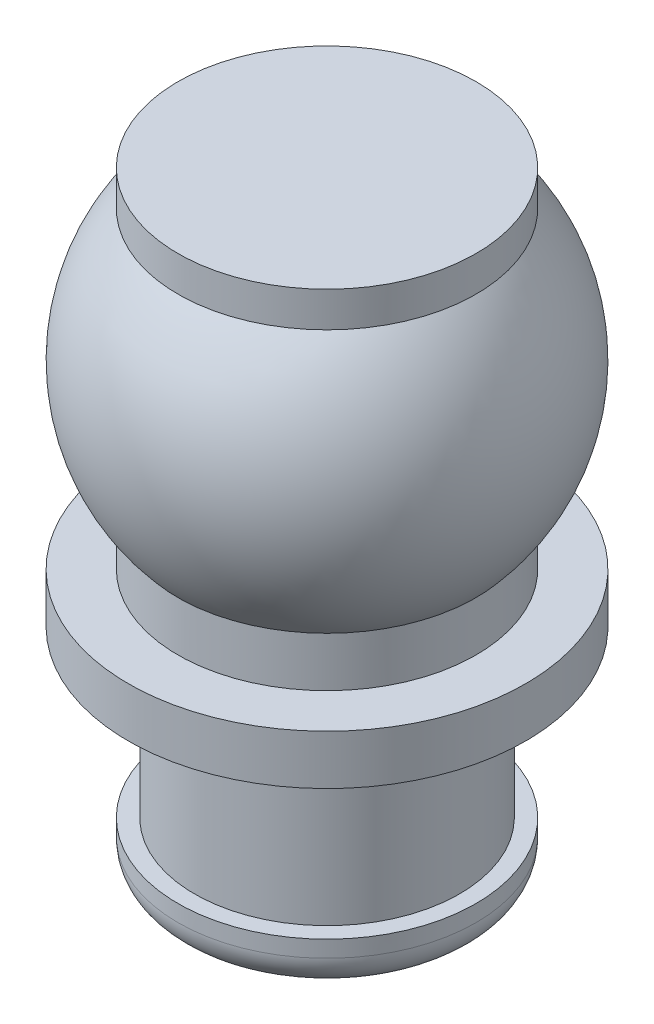
ISO-10303-21;
HEADER;
FILE_DESCRIPTION(('STEP AP214'),'2;1');
FILE_NAME('part.step','',(''),(''),'','','');
FILE_SCHEMA(('AUTOMOTIVE_DESIGN { 1 0 10303 214 1 1 1 1 }'));
ENDSEC;
DATA;
#1=APPLICATION_CONTEXT('core data for automotive mechanical design processes');
#2=APPLICATION_PROTOCOL_DEFINITION('international standard','automotive_design',2000,#1);
#3=PRODUCT_CONTEXT('',#1,'mechanical');
#4=PRODUCT('Part','Part','',(#3));
#5=PRODUCT_RELATED_PRODUCT_CATEGORY('part','',(#4));
#6=PRODUCT_DEFINITION_FORMATION('','',#4);
#7=PRODUCT_DEFINITION_CONTEXT('part definition',#1,'design');
#8=PRODUCT_DEFINITION('design','',#6,#7);
#9=PRODUCT_DEFINITION_SHAPE('','',#8);
#10=(LENGTH_UNIT() NAMED_UNIT(*) SI_UNIT(.MILLI.,.METRE.));
#11=(NAMED_UNIT(*) PLANE_ANGLE_UNIT() SI_UNIT($,.RADIAN.));
#12=(NAMED_UNIT(*) SI_UNIT($,.STERADIAN.) SOLID_ANGLE_UNIT());
#13=UNCERTAINTY_MEASURE_WITH_UNIT(LENGTH_MEASURE(1.E-05),#10,'distance_accuracy_value','');
#14=(GEOMETRIC_REPRESENTATION_CONTEXT(3) GLOBAL_UNCERTAINTY_ASSIGNED_CONTEXT((#13)) GLOBAL_UNIT_ASSIGNED_CONTEXT((#10,
#11,#12)) REPRESENTATION_CONTEXT('',''));
#15=CARTESIAN_POINT('',(0.,0.,0.));
#16=DIRECTION('',(0.,0.,1.));
#17=DIRECTION('',(1.,0.,0.));
#18=AXIS2_PLACEMENT_3D('',#15,#16,#17);
#19=CARTESIAN_POINT('',(-4.5,37.7895588976652,0.));
#20=DIRECTION('',(0.,-1.,0.));
#21=DIRECTION('',(0.,0.,-1.));
#22=AXIS2_PLACEMENT_3D('',#19,#20,#21);
#23=PLANE('',#22);
#24=CARTESIAN_POINT('',(0.,37.7895588976652,0.));
#25=DIRECTION('',(0.,-1.,0.));
#26=DIRECTION('',(0.,0.,-1.));
#27=AXIS2_PLACEMENT_3D('',#24,#25,#26);
#28=CIRCLE('',#27,6.);
#29=CARTESIAN_POINT('',(0.,37.7895588976652,-6.));
#30=VERTEX_POINT('',#29);
#31=EDGE_CURVE('E43',#30,#30,#28,.T.);
#32=ORIENTED_EDGE('',*,*,#31,.F.);
#33=EDGE_LOOP('',(#32));
#34=FACE_BOUND('',#33,.T.);
#35=CARTESIAN_POINT('',(0.,37.7895588976652,0.));
#36=DIRECTION('',(0.,-1.,0.));
#37=DIRECTION('',(0.,0.,-1.));
#38=AXIS2_PLACEMENT_3D('',#35,#36,#37);
#39=CIRCLE('',#38,4.5);
#40=CARTESIAN_POINT('',(0.,37.7895588976652,-4.5));
#41=VERTEX_POINT('',#40);
#42=EDGE_CURVE('E70',#41,#41,#39,.T.);
#43=ORIENTED_EDGE('',*,*,#42,.T.);
#44=EDGE_LOOP('',(#43));
#45=FACE_BOUND('',#44,.T.);
#46=ADVANCED_FACE('F33',(#34,#45),#23,.F.);
#47=CARTESIAN_POINT('',(0.,0.,0.));
#48=DIRECTION('',(0.,-1.,0.));
#49=DIRECTION('',(0.,0.,-1.));
#50=AXIS2_PLACEMENT_3D('',#47,#48,#49);
#51=CYLINDRICAL_SURFACE('',#50,6.);
#52=CARTESIAN_POINT('',(0.,36.2895588976652,0.));
#53=DIRECTION('',(0.,-1.,0.));
#54=DIRECTION('',(0.,0.,-1.));
#55=AXIS2_PLACEMENT_3D('',#52,#53,#54);
#56=CIRCLE('',#55,6.);
#57=CARTESIAN_POINT('',(0.,36.2895588976652,-6.));
#58=VERTEX_POINT('',#57);
#59=EDGE_CURVE('E47',#58,#58,#56,.T.);
#60=ORIENTED_EDGE('',*,*,#59,.F.);
#61=EDGE_LOOP('',(#60));
#62=FACE_BOUND('',#61,.T.);
#63=ORIENTED_EDGE('',*,*,#31,.T.);
#64=EDGE_LOOP('',(#63));
#65=FACE_BOUND('',#64,.T.);
#66=ADVANCED_FACE('F104',(#62,#65),#51,.T.);
#67=CARTESIAN_POINT('',(-6.,36.2895588976652,0.));
#68=DIRECTION('',(0.,1.,0.));
#69=DIRECTION('',(0.,0.,1.));
#70=AXIS2_PLACEMENT_3D('',#67,#68,#69);
#71=PLANE('',#70);
#72=CARTESIAN_POINT('',(0.,36.2895588976652,0.));
#73=DIRECTION('',(0.,-1.,0.));
#74=DIRECTION('',(0.,0.,-1.));
#75=AXIS2_PLACEMENT_3D('',#72,#73,#74);
#76=CIRCLE('',#75,4.);
#77=CARTESIAN_POINT('',(0.,36.2895588976652,-4.));
#78=VERTEX_POINT('',#77);
#79=EDGE_CURVE('E52',#78,#78,#76,.T.);
#80=ORIENTED_EDGE('',*,*,#79,.F.);
#81=EDGE_LOOP('',(#80));
#82=FACE_BOUND('',#81,.T.);
#83=ORIENTED_EDGE('',*,*,#59,.T.);
#84=EDGE_LOOP('',(#83));
#85=FACE_BOUND('',#84,.T.);
#86=ADVANCED_FACE('F109',(#82,#85),#71,.F.);
#87=CARTESIAN_POINT('',(0.,0.,0.));
#88=DIRECTION('',(0.,-1.,0.));
#89=DIRECTION('',(0.,0.,-1.));
#90=AXIS2_PLACEMENT_3D('',#87,#88,#89);
#91=CYLINDRICAL_SURFACE('',#90,4.);
#92=CARTESIAN_POINT('',(0.,31.2895588976652,0.));
#93=DIRECTION('',(0.,-1.,0.));
#94=DIRECTION('',(0.,0.,-1.));
#95=AXIS2_PLACEMENT_3D('',#92,#93,#94);
#96=CIRCLE('',#95,4.);
#97=CARTESIAN_POINT('',(0.,31.2895588976652,-4.));
#98=VERTEX_POINT('',#97);
#99=EDGE_CURVE('E55',#98,#98,#96,.T.);
#100=ORIENTED_EDGE('',*,*,#99,.F.);
#101=EDGE_LOOP('',(#100));
#102=FACE_BOUND('',#101,.T.);
#103=ORIENTED_EDGE('',*,*,#79,.T.);
#104=EDGE_LOOP('',(#103));
#105=FACE_BOUND('',#104,.T.);
#106=ADVANCED_FACE('F116',(#102,#105),#91,.T.);
#107=CARTESIAN_POINT('',(-4.,31.2895588976652,0.));
#108=DIRECTION('',(0.,-1.,0.));
#109=DIRECTION('',(0.,0.,-1.));
#110=AXIS2_PLACEMENT_3D('',#107,#108,#109);
#111=PLANE('',#110);
#112=CARTESIAN_POINT('',(0.,31.2895588976652,0.));
#113=DIRECTION('',(0.,-1.,0.));
#114=DIRECTION('',(0.,0.,-1.));
#115=AXIS2_PLACEMENT_3D('',#112,#113,#114);
#116=CIRCLE('',#115,4.5);
#117=CARTESIAN_POINT('',(0.,31.2895588976652,-4.5));
#118=VERTEX_POINT('',#117);
#119=EDGE_CURVE('E58',#118,#118,#116,.T.);
#120=ORIENTED_EDGE('',*,*,#119,.F.);
#121=EDGE_LOOP('',(#120));
#122=FACE_BOUND('',#121,.T.);
#123=ORIENTED_EDGE('',*,*,#99,.T.);
#124=EDGE_LOOP('',(#123));
#125=FACE_BOUND('',#124,.T.);
#126=ADVANCED_FACE('F123',(#122,#125),#111,.F.);
#127=CARTESIAN_POINT('',(0.,0.,0.));
#128=DIRECTION('',(0.,-1.,0.));
#129=DIRECTION('',(0.,0.,-1.));
#130=AXIS2_PLACEMENT_3D('',#127,#128,#129);
#131=CYLINDRICAL_SURFACE('',#130,4.5);
#132=CARTESIAN_POINT('',(0.,30.7895588976652,0.));
#133=DIRECTION('',(0.,1.,0.));
#134=DIRECTION('',(0.,0.,1.));
#135=AXIS2_PLACEMENT_3D('',#132,#133,#134);
#136=CIRCLE('',#135,4.5);
#137=CARTESIAN_POINT('',(0.,30.7895588976652,4.5));
#138=VERTEX_POINT('',#137);
#139=EDGE_CURVE('E10',#138,#138,#136,.T.);
#140=ORIENTED_EDGE('',*,*,#139,.T.);
#141=EDGE_LOOP('',(#140));
#142=FACE_BOUND('',#141,.T.);
#143=ORIENTED_EDGE('',*,*,#119,.T.);
#144=EDGE_LOOP('',(#143));
#145=FACE_BOUND('',#144,.T.);
#146=ADVANCED_FACE('F101',(#142,#145),#131,.T.);
#147=CARTESIAN_POINT('',(-4.5,29.7895588976652,0.));
#148=DIRECTION('',(0.,1.,0.));
#149=DIRECTION('',(0.,0.,1.));
#150=AXIS2_PLACEMENT_3D('',#147,#148,#149);
#151=PLANE('',#150);
#152=CARTESIAN_POINT('',(0.,29.7895588976652,0.));
#153=DIRECTION('',(0.,1.,0.));
#154=DIRECTION('',(0.,0.,1.));
#155=AXIS2_PLACEMENT_3D('',#152,#153,#154);
#156=CIRCLE('',#155,3.5);
#157=CARTESIAN_POINT('',(0.,29.7895588976652,3.5));
#158=VERTEX_POINT('',#157);
#159=EDGE_CURVE('E39',#158,#158,#156,.F.);
#160=ORIENTED_EDGE('',*,*,#159,.T.);
#161=EDGE_LOOP('',(#160));
#162=FACE_BOUND('',#161,.T.);
#163=ADVANCED_FACE('F96',(#162),#151,.F.);
#164=CARTESIAN_POINT('',(0.,48.2895588976652,0.));
#165=DIRECTION('',(0.,-1.,0.));
#166=DIRECTION('',(0.,0.,-1.));
#167=AXIS2_PLACEMENT_3D('',#164,#165,#166);
#168=PLANE('',#167);
#169=CARTESIAN_POINT('',(0.,48.2895588976652,0.));
#170=DIRECTION('',(0.,-1.,0.));
#171=DIRECTION('',(0.,0.,-1.));
#172=AXIS2_PLACEMENT_3D('',#169,#170,#171);
#173=CIRCLE('',#172,4.5);
#174=CARTESIAN_POINT('',(0.,48.2895588976652,-4.5));
#175=VERTEX_POINT('',#174);
#176=EDGE_CURVE('E61',#175,#175,#173,.T.);
#177=ORIENTED_EDGE('',*,*,#176,.F.);
#178=EDGE_LOOP('',(#177));
#179=FACE_BOUND('',#178,.T.);
#180=ADVANCED_FACE('F91',(#179),#168,.F.);
#181=CARTESIAN_POINT('',(0.,0.,0.));
#182=DIRECTION('',(0.,-1.,0.));
#183=DIRECTION('',(0.,0.,-1.));
#184=AXIS2_PLACEMENT_3D('',#181,#182,#183);
#185=CYLINDRICAL_SURFACE('',#184,4.5);
#186=CARTESIAN_POINT('',(0.,47.2268128308589,0.));
#187=DIRECTION('',(0.,-1.,0.));
#188=DIRECTION('',(0.,0.,-1.));
#189=AXIS2_PLACEMENT_3D('',#186,#187,#188);
#190=CIRCLE('',#189,4.5);
#191=CARTESIAN_POINT('',(-4.5,47.2268128308589,0.));
#192=VERTEX_POINT('',#191);
#193=EDGE_CURVE('E64',#192,#192,#190,.T.);
#194=ORIENTED_EDGE('',*,*,#193,.F.);
#195=EDGE_LOOP('',(#194));
#196=FACE_BOUND('',#195,.T.);
#197=ORIENTED_EDGE('',*,*,#176,.T.);
#198=EDGE_LOOP('',(#197));
#199=FACE_BOUND('',#198,.T.);
#200=ADVANCED_FACE('F85',(#196,#199),#185,.T.);
#201=CARTESIAN_POINT('',(0.,43.258185864262,0.));
#202=DIRECTION('',(0.,-1.,0.));
#203=DIRECTION('',(-1.,0.,0.));
#204=AXIS2_PLACEMENT_3D('',#201,#202,#203);
#205=SPHERICAL_SURFACE('',#204,6.);
#206=CARTESIAN_POINT('',(0.,39.2895588976652,0.));
#207=DIRECTION('',(0.,-1.,0.));
#208=DIRECTION('',(0.,0.,-1.));
#209=AXIS2_PLACEMENT_3D('',#206,#207,#208);
#210=CIRCLE('',#209,4.5);
#211=CARTESIAN_POINT('',(-4.5,39.2895588976652,0.));
#212=VERTEX_POINT('',#211);
#213=EDGE_CURVE('E67',#212,#212,#210,.T.);
#214=CARTESIAN_POINT('',(-4.5,39.2895588976652,0.));
#215=CARTESIAN_POINT('',(-4.55975663481962,39.3573142945571,0.));
#216=CARTESIAN_POINT('',(-4.61798068485084,39.4264211482744,0.));
#217=CARTESIAN_POINT('',(-4.73124994921595,39.5671926716747,0.));
#218=CARTESIAN_POINT('',(-4.78629516354986,39.6388573413576,0.));
#219=CARTESIAN_POINT('',(-4.89309309039987,39.784599399004,0.));
#220=CARTESIAN_POINT('',(-4.94484580291597,39.8586767869674,0.));
#221=CARTESIAN_POINT('',(-5.04495351457591,40.0090928632068,0.));
#222=CARTESIAN_POINT('',(-5.09330851371974,40.0854315514828,0.));
#223=CARTESIAN_POINT('',(-5.18652205302433,40.2402145718287,0.));
#224=CARTESIAN_POINT('',(-5.23138059318509,40.3186589038987,0.));
#225=CARTESIAN_POINT('',(-5.31750972666551,40.4774931592837,0.));
#226=CARTESIAN_POINT('',(-5.35878031998517,40.5578830825988,0.));
#227=CARTESIAN_POINT('',(-5.43764935813207,40.7204445256959,0.));
#228=CARTESIAN_POINT('',(-5.47524780295931,40.802616045478,0.));
#229=CARTESIAN_POINT('',(-5.54669584283946,40.9685730449555,0.));
#230=CARTESIAN_POINT('',(-5.58054543789237,41.0523585246509,0.));
#231=CARTESIAN_POINT('',(-5.64442672242946,41.2213725167539,0.));
#232=CARTESIAN_POINT('',(-5.67445841191365,41.3066010291613,0.));
#233=CARTESIAN_POINT('',(-5.73064261892771,41.4783272150927,0.));
#234=CARTESIAN_POINT('',(-5.75679513645758,41.5648248886165,0.));
#235=CARTESIAN_POINT('',(-5.8051676467581,41.7389129361557,0.));
#236=CARTESIAN_POINT('',(-5.82738763952874,41.8265033101711,0.));
#237=CARTESIAN_POINT('',(-5.86784977014805,42.002598068854,0.));
#238=CARTESIAN_POINT('',(-5.88609190799673,42.0911024535215,0.));
#239=CARTESIAN_POINT('',(-5.91856111366939,42.2688446790407,0.));
#240=CARTESIAN_POINT('',(-5.93278818149338,42.3580825198924,0.));
#241=CARTESIAN_POINT('',(-5.95719822301079,42.5371096070126,0.));
#242=CARTESIAN_POINT('',(-5.96738119670422,42.6268988532811,0.));
#243=CARTESIAN_POINT('',(-5.98368227605823,42.8068455755672,0.));
#244=CARTESIAN_POINT('',(-5.98980038171882,42.8970030515847,0.));
#245=CARTESIAN_POINT('',(-5.99795924368971,43.0775023064888,0.));
#246=CARTESIAN_POINT('',(-6.,43.1678440853754,0.));
#247=CARTESIAN_POINT('',(-6.,43.3485276431487,0.));
#248=CARTESIAN_POINT('',(-5.99795924368971,43.4388694220353,0.));
#249=CARTESIAN_POINT('',(-5.98980038171882,43.6193686769394,0.));
#250=CARTESIAN_POINT('',(-5.98368227605823,43.7095261529569,0.));
#251=CARTESIAN_POINT('',(-5.96738119670422,43.889472875243,0.));
#252=CARTESIAN_POINT('',(-5.95719822301079,43.9792621215115,0.));
#253=CARTESIAN_POINT('',(-5.93278818149338,44.1582892086317,0.));
#254=CARTESIAN_POINT('',(-5.91856111366939,44.2475270494834,0.));
#255=CARTESIAN_POINT('',(-5.88609190799673,44.4252692750025,0.));
#256=CARTESIAN_POINT('',(-5.86784977014805,44.5137736596701,0.));
#257=CARTESIAN_POINT('',(-5.82738763952874,44.689868418353,0.));
#258=CARTESIAN_POINT('',(-5.8051676467581,44.7774587923683,0.));
#259=CARTESIAN_POINT('',(-5.75679513645758,44.9515468399076,0.));
#260=CARTESIAN_POINT('',(-5.7306426189277,45.0380445134314,0.));
#261=CARTESIAN_POINT('',(-5.67445841191364,45.2097706993628,0.));
#262=CARTESIAN_POINT('',(-5.64442672242946,45.2949992117702,0.));
#263=CARTESIAN_POINT('',(-5.58054543789236,45.4640132038731,0.));
#264=CARTESIAN_POINT('',(-5.54669584283945,45.5477986835686,0.));
#265=CARTESIAN_POINT('',(-5.4752478029593,45.7137556830461,0.));
#266=CARTESIAN_POINT('',(-5.43764935813207,45.7959272028281,0.));
#267=CARTESIAN_POINT('',(-5.35878031998517,45.9584886459253,0.));
#268=CARTESIAN_POINT('',(-5.31750972666551,46.0388785692404,0.));
#269=CARTESIAN_POINT('',(-5.23138059318509,46.1977128246254,0.));
#270=CARTESIAN_POINT('',(-5.18652205302432,46.2761571566954,0.));
#271=CARTESIAN_POINT('',(-5.09330851371973,46.4309401770413,0.));
#272=CARTESIAN_POINT('',(-5.0449535145759,46.5072788653173,0.));
#273=CARTESIAN_POINT('',(-4.94484580291597,46.6576949415567,0.));
#274=CARTESIAN_POINT('',(-4.89309309039986,46.7317723295201,0.));
#275=CARTESIAN_POINT('',(-4.78629516354985,46.8775143871665,0.));
#276=CARTESIAN_POINT('',(-4.73124994921595,46.9491790568494,0.));
#277=CARTESIAN_POINT('',(-4.61798068485083,47.0899505802497,0.));
#278=CARTESIAN_POINT('',(-4.55975663481962,47.159057433967,0.));
#279=CARTESIAN_POINT('',(-4.5,47.2268128308589,0.));
#280=B_SPLINE_CURVE_WITH_KNOTS('',3,(#214,#215,#216,#217,#218,#219,#220,#221,#222,#223,#224,
#225,#226,#227,#228,#229,#230,#231,#232,#233,#234,#235,#236,#237,#238,#239,#240,#241,#242,#243,
#244,#245,#246,#247,#248,#249,#250,#251,#252,#253,#254,#255,#256,#257,#258,#259,#260,#261,#262,
#263,#264,#265,#266,#267,#268,#269,#270,#271,#272,#273,#274,#275,#276,#277,#278,#279),
.UNSPECIFIED.,.F.,.F.,(4,2,2,2,2,2,2,2,2,2,2,2,2,2,2,2,2,2,2,2,2,2,2,2,2,2,2,2,2,2,2,2,4),(0.,
0.27100230174091,0.54200460348182,0.813006905222731,1.08400920696364,1.35501150870455,
1.62601381044546,1.89701611218637,2.16801841392728,2.43902071566819,2.7100230174091,
2.98102531915001,3.25202762089092,3.52302992263183,3.79403222437274,4.06503452611365,
4.33603682785456,4.60703912959547,4.87804143133638,5.14904373307729,5.4200460348182,
5.69104833655911,5.96205063830002,6.23305294004093,6.50405524178184,6.77505754352275,
7.04605984526366,7.31706214700457,7.58806444874548,7.8590667504864,8.1300690522273,
8.40107135396821,8.67207365570912),.UNSPECIFIED.);
#281=EDGE_CURVE('BSEAM79',#212,#192,#280,.T.);
#282=ORIENTED_EDGE('',*,*,#213,.F.);
#283=ORIENTED_EDGE('',*,*,#193,.T.);
#284=ORIENTED_EDGE('',*,*,#281,.T.);
#285=ORIENTED_EDGE('',*,*,#281,.F.);
#286=EDGE_LOOP('',(#282,#284,#283,#285));
#287=FACE_BOUND('',#286,.T.);
#288=ADVANCED_FACE('F79',(#287),#205,.T.);
#289=CARTESIAN_POINT('',(0.,0.,0.));
#290=DIRECTION('',(0.,-1.,0.));
#291=DIRECTION('',(0.,0.,-1.));
#292=AXIS2_PLACEMENT_3D('',#289,#290,#291);
#293=CYLINDRICAL_SURFACE('',#292,4.5);
#294=ORIENTED_EDGE('',*,*,#42,.F.);
#295=EDGE_LOOP('',(#294));
#296=FACE_BOUND('',#295,.T.);
#297=ORIENTED_EDGE('',*,*,#213,.T.);
#298=EDGE_LOOP('',(#297));
#299=FACE_BOUND('',#298,.T.);
#300=ADVANCED_FACE('F75',(#296,#299),#293,.T.);
#301=CARTESIAN_POINT('',(0.,30.7895588976652,0.));
#302=DIRECTION('',(0.,1.,0.));
#303=DIRECTION('',(0.,0.,1.));
#304=AXIS2_PLACEMENT_3D('',#301,#302,#303);
#305=TOROIDAL_SURFACE('',#304,3.5,1.);
#306=ORIENTED_EDGE('',*,*,#139,.F.);
#307=EDGE_LOOP('',(#306));
#308=FACE_BOUND('',#307,.T.);
#309=ORIENTED_EDGE('',*,*,#159,.F.);
#310=EDGE_LOOP('',(#309));
#311=FACE_BOUND('',#310,.T.);
#312=ADVANCED_FACE('F78',(#308,#311),#305,.T.);
#313=CLOSED_SHELL('',(#46,#66,#86,#106,#126,#146,#163,#180,#200,#288,#300,#312));
#314=MANIFOLD_SOLID_BREP('B2',#313);
#315=ADVANCED_BREP_SHAPE_REPRESENTATION('',(#18,#314),#14);
#316=SHAPE_DEFINITION_REPRESENTATION(#9,#315);
ENDSEC;
END-ISO-10303-21;
